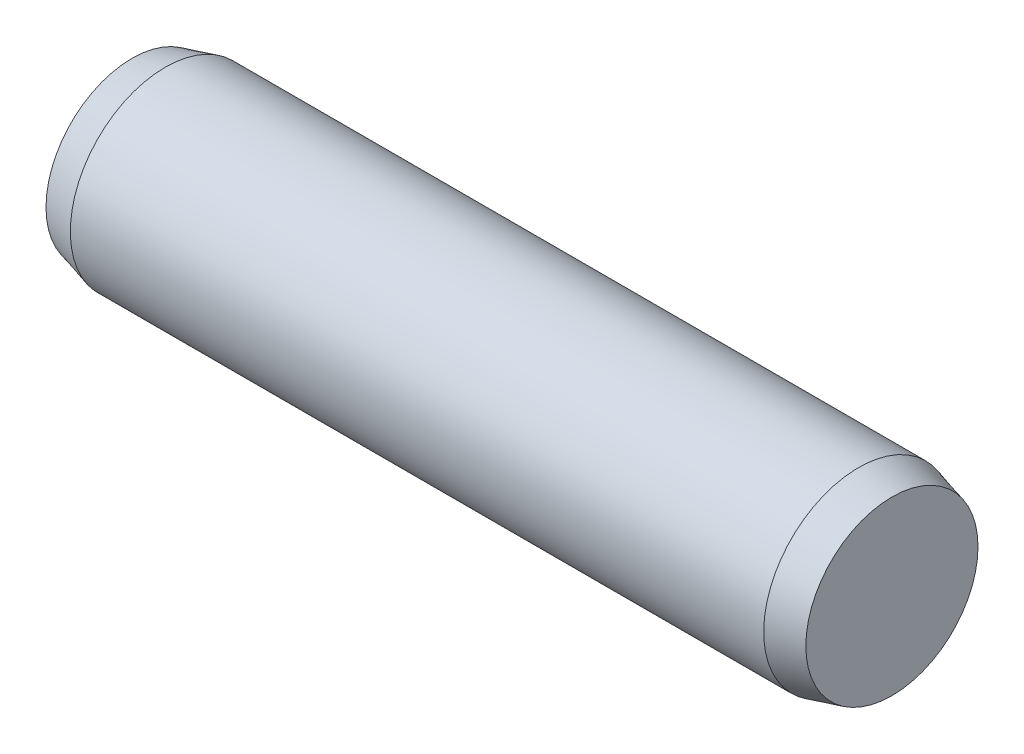
ISO-10303-21;
HEADER;
FILE_DESCRIPTION(('STEP AP214'),'2;1');
FILE_NAME('part.step','',(''),(''),'','','');
FILE_SCHEMA(('AUTOMOTIVE_DESIGN { 1 0 10303 214 1 1 1 1 }'));
ENDSEC;
DATA;
#1=APPLICATION_CONTEXT('core data for automotive mechanical design processes');
#2=APPLICATION_PROTOCOL_DEFINITION('international standard','automotive_design',2000,#1);
#3=PRODUCT_CONTEXT('',#1,'mechanical');
#4=PRODUCT('Part','Part','',(#3));
#5=PRODUCT_RELATED_PRODUCT_CATEGORY('part','',(#4));
#6=PRODUCT_DEFINITION_FORMATION('','',#4);
#7=PRODUCT_DEFINITION_CONTEXT('part definition',#1,'design');
#8=PRODUCT_DEFINITION('design','',#6,#7);
#9=PRODUCT_DEFINITION_SHAPE('','',#8);
#10=(LENGTH_UNIT() NAMED_UNIT(*) SI_UNIT(.MILLI.,.METRE.));
#11=(NAMED_UNIT(*) PLANE_ANGLE_UNIT() SI_UNIT($,.RADIAN.));
#12=(NAMED_UNIT(*) SI_UNIT($,.STERADIAN.) SOLID_ANGLE_UNIT());
#13=UNCERTAINTY_MEASURE_WITH_UNIT(LENGTH_MEASURE(1.E-05),#10,'distance_accuracy_value','');
#14=(GEOMETRIC_REPRESENTATION_CONTEXT(3) GLOBAL_UNCERTAINTY_ASSIGNED_CONTEXT((#13)) GLOBAL_UNIT_ASSIGNED_CONTEXT((#10,
#11,#12)) REPRESENTATION_CONTEXT('',''));
#15=CARTESIAN_POINT('',(0.,0.,0.));
#16=DIRECTION('',(0.,0.,1.));
#17=DIRECTION('',(1.,0.,0.));
#18=AXIS2_PLACEMENT_3D('',#15,#16,#17);
#19=CARTESIAN_POINT('',(-4.,0.,0.));
#20=DIRECTION('',(-1.,0.,0.));
#21=DIRECTION('',(0.,0.,1.));
#22=AXIS2_PLACEMENT_3D('',#19,#20,#21);
#23=PLANE('',#22);
#24=CARTESIAN_POINT('',(-3.99999999996226,0.,0.));
#25=DIRECTION('',(1.,0.,0.));
#26=DIRECTION('',(0.,1.,0.));
#27=AXIS2_PLACEMENT_3D('',#24,#25,#26);
#28=CIRCLE('',#27,0.906217782644256);
#29=CARTESIAN_POINT('',(-3.99999999996226,0.906217782644256,0.));
#30=VERTEX_POINT('',#29);
#31=EDGE_CURVE('E17',#30,#30,#28,.T.);
#32=ORIENTED_EDGE('',*,*,#31,.F.);
#33=EDGE_LOOP('',(#32));
#34=FACE_BOUND('',#33,.T.);
#35=ADVANCED_FACE('F14',(#34),#23,.T.);
#36=CARTESIAN_POINT('',(4.,0.,0.));
#37=DIRECTION('',(1.,0.,0.));
#38=DIRECTION('',(0.,0.,-1.));
#39=AXIS2_PLACEMENT_3D('',#36,#37,#38);
#40=PLANE('',#39);
#41=CARTESIAN_POINT('',(3.99999999996226,0.,0.));
#42=DIRECTION('',(-1.,0.,0.));
#43=DIRECTION('',(0.,-1.,0.));
#44=AXIS2_PLACEMENT_3D('',#41,#42,#43);
#45=CIRCLE('',#44,0.906217782644256);
#46=CARTESIAN_POINT('',(3.99999999996226,-0.906217782644256,0.));
#47=VERTEX_POINT('',#46);
#48=EDGE_CURVE('E26',#47,#47,#45,.T.);
#49=ORIENTED_EDGE('',*,*,#48,.F.);
#50=EDGE_LOOP('',(#49));
#51=FACE_BOUND('',#50,.T.);
#52=ADVANCED_FACE('F38',(#51),#40,.T.);
#53=CARTESIAN_POINT('',(-3.65000000010696,0.,0.));
#54=DIRECTION('',(1.,0.,0.));
#55=DIRECTION('',(0.,1.,0.));
#56=AXIS2_PLACEMENT_3D('',#53,#54,#55);
#57=CONICAL_SURFACE('',#56,0.999999999947931,0.261799387776636);
#58=ORIENTED_EDGE('',*,*,#31,.T.);
#59=EDGE_LOOP('',(#58));
#60=FACE_BOUND('',#59,.T.);
#61=CARTESIAN_POINT('',(-3.65,0.,0.));
#62=DIRECTION('',(1.,0.,0.));
#63=DIRECTION('',(0.,0.,-1.));
#64=AXIS2_PLACEMENT_3D('',#61,#62,#63);
#65=CIRCLE('',#64,1.);
#66=CARTESIAN_POINT('',(-3.65,0.,-1.));
#67=VERTEX_POINT('',#66);
#68=EDGE_CURVE('E21',#67,#67,#65,.T.);
#69=ORIENTED_EDGE('',*,*,#68,.F.);
#70=EDGE_LOOP('',(#69));
#71=FACE_BOUND('',#70,.T.);
#72=ADVANCED_FACE('F34',(#60,#71),#57,.T.);
#73=CARTESIAN_POINT('',(3.65000000010696,0.,0.));
#74=DIRECTION('',(-1.,0.,0.));
#75=DIRECTION('',(0.,-1.,0.));
#76=AXIS2_PLACEMENT_3D('',#73,#74,#75);
#77=CONICAL_SURFACE('',#76,0.999999999947931,0.261799387776636);
#78=ORIENTED_EDGE('',*,*,#48,.T.);
#79=EDGE_LOOP('',(#78));
#80=FACE_BOUND('',#79,.T.);
#81=CARTESIAN_POINT('',(3.65000000000001,0.,0.));
#82=DIRECTION('',(1.,0.,0.));
#83=DIRECTION('',(0.,0.,-1.));
#84=AXIS2_PLACEMENT_3D('',#81,#82,#83);
#85=CIRCLE('',#84,1.);
#86=CARTESIAN_POINT('',(3.65000000000001,0.,-1.));
#87=VERTEX_POINT('',#86);
#88=EDGE_CURVE('E10',#87,#87,#85,.F.);
#89=ORIENTED_EDGE('',*,*,#88,.F.);
#90=EDGE_LOOP('',(#89));
#91=FACE_BOUND('',#90,.T.);
#92=ADVANCED_FACE('F46',(#80,#91),#77,.T.);
#93=CARTESIAN_POINT('',(-3.65,0.,0.));
#94=DIRECTION('',(1.,0.,0.));
#95=DIRECTION('',(0.,0.,-1.));
#96=AXIS2_PLACEMENT_3D('',#93,#94,#95);
#97=CYLINDRICAL_SURFACE('',#96,1.);
#98=ORIENTED_EDGE('',*,*,#88,.T.);
#99=EDGE_LOOP('',(#98));
#100=FACE_BOUND('',#99,.T.);
#101=ORIENTED_EDGE('',*,*,#68,.T.);
#102=EDGE_LOOP('',(#101));
#103=FACE_BOUND('',#102,.T.);
#104=ADVANCED_FACE('F44',(#100,#103),#97,.T.);
#105=CLOSED_SHELL('',(#35,#52,#72,#92,#104));
#106=MANIFOLD_SOLID_BREP('B1',#105);
#107=ADVANCED_BREP_SHAPE_REPRESENTATION('',(#18,#106),#14);
#108=SHAPE_DEFINITION_REPRESENTATION(#9,#107);
ENDSEC;
END-ISO-10303-21;
